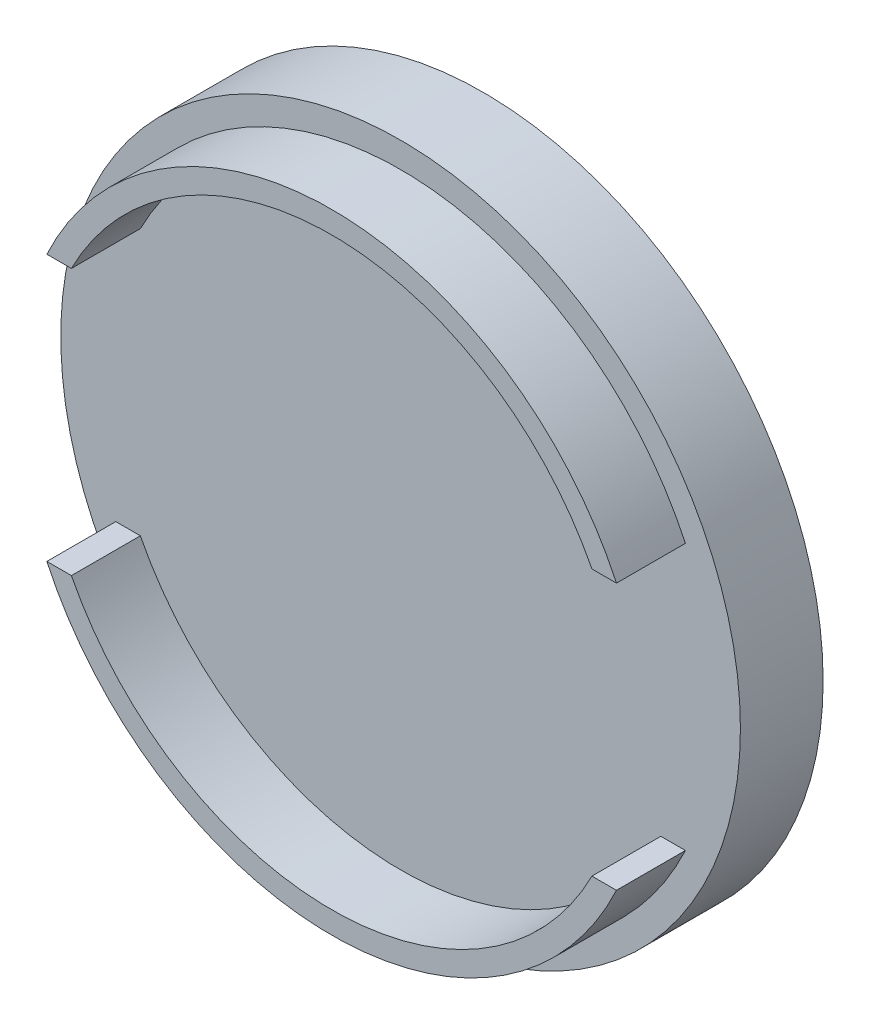
ISO-10303-21;
HEADER;
FILE_DESCRIPTION(('STEP AP214'),'2;1');
FILE_NAME('part.step','',(''),(''),'','','');
FILE_SCHEMA(('AUTOMOTIVE_DESIGN { 1 0 10303 214 1 1 1 1 }'));
ENDSEC;
DATA;
#1=APPLICATION_CONTEXT('core data for automotive mechanical design processes');
#2=APPLICATION_PROTOCOL_DEFINITION('international standard','automotive_design',2000,#1);
#3=PRODUCT_CONTEXT('',#1,'mechanical');
#4=PRODUCT('Part','Part','',(#3));
#5=PRODUCT_RELATED_PRODUCT_CATEGORY('part','',(#4));
#6=PRODUCT_DEFINITION_FORMATION('','',#4);
#7=PRODUCT_DEFINITION_CONTEXT('part definition',#1,'design');
#8=PRODUCT_DEFINITION('design','',#6,#7);
#9=PRODUCT_DEFINITION_SHAPE('','',#8);
#10=(LENGTH_UNIT() NAMED_UNIT(*) SI_UNIT(.MILLI.,.METRE.));
#11=(NAMED_UNIT(*) PLANE_ANGLE_UNIT() SI_UNIT($,.RADIAN.));
#12=(NAMED_UNIT(*) SI_UNIT($,.STERADIAN.) SOLID_ANGLE_UNIT());
#13=UNCERTAINTY_MEASURE_WITH_UNIT(LENGTH_MEASURE(1.E-05),#10,'distance_accuracy_value','');
#14=(GEOMETRIC_REPRESENTATION_CONTEXT(3) GLOBAL_UNCERTAINTY_ASSIGNED_CONTEXT((#13)) GLOBAL_UNIT_ASSIGNED_CONTEXT((#10,
#11,#12)) REPRESENTATION_CONTEXT('',''));
#15=CARTESIAN_POINT('',(0.,0.,0.));
#16=DIRECTION('',(0.,0.,1.));
#17=DIRECTION('',(1.,0.,0.));
#18=AXIS2_PLACEMENT_3D('',#15,#16,#17);
#19=CARTESIAN_POINT('',(0.,0.,11.));
#20=DIRECTION('',(0.,0.,1.));
#21=DIRECTION('',(1.,0.,0.));
#22=AXIS2_PLACEMENT_3D('',#19,#20,#21);
#23=PLANE('',#22);
#24=DIRECTION('',(-1.,0.,0.));
#25=VECTOR('',#24,1.);
#26=CARTESIAN_POINT('',(18.8778187983431,9.64717354549633,11.));
#27=LINE('',#26,#25);
#28=CARTESIAN_POINT('',(20.6584617671083,9.64717354549633,11.));
#29=VERTEX_POINT('',#28);
#30=CARTESIAN_POINT('',(18.8778187983431,9.64717354549633,11.));
#31=VERTEX_POINT('',#30);
#32=EDGE_CURVE('E107',#29,#31,#27,.T.);
#33=ORIENTED_EDGE('',*,*,#32,.F.);
#34=CARTESIAN_POINT('',(0.,0.,11.));
#35=DIRECTION('',(0.,0.,1.));
#36=DIRECTION('',(1.,0.,0.));
#37=AXIS2_PLACEMENT_3D('',#34,#35,#36);
#38=CIRCLE('',#37,22.8);
#39=CARTESIAN_POINT('',(-20.6584617671083,9.64717354549633,11.));
#40=VERTEX_POINT('',#39);
#41=EDGE_CURVE('E129',#29,#40,#38,.T.);
#42=ORIENTED_EDGE('',*,*,#41,.T.);
#43=DIRECTION('',(-1.,0.,0.));
#44=VECTOR('',#43,1.);
#45=CARTESIAN_POINT('',(-20.6584617671083,9.64717354549633,11.));
#46=LINE('',#45,#44);
#47=CARTESIAN_POINT('',(-18.8778187983431,9.64717354549633,11.));
#48=VERTEX_POINT('',#47);
#49=EDGE_CURVE('E154',#48,#40,#46,.T.);
#50=ORIENTED_EDGE('',*,*,#49,.F.);
#51=CARTESIAN_POINT('',(0.,0.,11.));
#52=DIRECTION('',(0.,0.,1.));
#53=DIRECTION('',(1.,0.,0.));
#54=AXIS2_PLACEMENT_3D('',#51,#52,#53);
#55=CIRCLE('',#54,21.2);
#56=EDGE_CURVE('E138',#31,#48,#55,.T.);
#57=ORIENTED_EDGE('',*,*,#56,.F.);
#58=EDGE_LOOP('',(#33,#42,#50,#57));
#59=FACE_BOUND('',#58,.T.);
#60=ADVANCED_FACE('F33',(#59),#23,.T.);
#61=CARTESIAN_POINT('',(0.,0.,11.));
#62=DIRECTION('',(0.,0.,-1.));
#63=DIRECTION('',(-1.,0.,0.));
#64=AXIS2_PLACEMENT_3D('',#61,#62,#63);
#65=CYLINDRICAL_SURFACE('',#64,22.8);
#66=ORIENTED_EDGE('',*,*,#41,.F.);
#67=DIRECTION('',(0.,0.,1.));
#68=VECTOR('',#67,1.);
#69=CARTESIAN_POINT('',(20.6584617671083,9.64717354549633,6.));
#70=LINE('',#69,#68);
#71=CARTESIAN_POINT('',(20.6584617671083,9.64717354549633,6.));
#72=VERTEX_POINT('',#71);
#73=EDGE_CURVE('E160',#72,#29,#70,.T.);
#74=ORIENTED_EDGE('',*,*,#73,.F.);
#75=CARTESIAN_POINT('',(0.,0.,6.));
#76=DIRECTION('',(0.,0.,1.));
#77=DIRECTION('',(1.,0.,0.));
#78=AXIS2_PLACEMENT_3D('',#75,#76,#77);
#79=CIRCLE('',#78,22.8);
#80=CARTESIAN_POINT('',(-20.6584617671083,9.64717354549633,6.));
#81=VERTEX_POINT('',#80);
#82=EDGE_CURVE('E131',#72,#81,#79,.T.);
#83=ORIENTED_EDGE('',*,*,#82,.T.);
#84=DIRECTION('',(0.,0.,1.));
#85=VECTOR('',#84,1.);
#86=CARTESIAN_POINT('',(-20.6584617671083,9.64717354549633,6.));
#87=LINE('',#86,#85);
#88=EDGE_CURVE('E143',#81,#40,#87,.T.);
#89=ORIENTED_EDGE('',*,*,#88,.T.);
#90=EDGE_LOOP('',(#66,#74,#83,#89));
#91=FACE_BOUND('',#90,.T.);
#92=ADVANCED_FACE('F191',(#91),#65,.T.);
#93=CARTESIAN_POINT('',(0.,0.,11.));
#94=DIRECTION('',(0.,0.,-1.));
#95=DIRECTION('',(-1.,0.,0.));
#96=AXIS2_PLACEMENT_3D('',#93,#94,#95);
#97=CYLINDRICAL_SURFACE('',#96,21.2);
#98=DIRECTION('',(0.,0.,1.));
#99=VECTOR('',#98,1.);
#100=CARTESIAN_POINT('',(18.8778187983431,9.64717354549633,6.));
#101=LINE('',#100,#99);
#102=CARTESIAN_POINT('',(18.8778187983431,9.64717354549633,6.));
#103=VERTEX_POINT('',#102);
#104=EDGE_CURVE('E162',#103,#31,#101,.T.);
#105=ORIENTED_EDGE('',*,*,#104,.T.);
#106=ORIENTED_EDGE('',*,*,#56,.T.);
#107=DIRECTION('',(0.,0.,1.));
#108=VECTOR('',#107,1.);
#109=CARTESIAN_POINT('',(-18.8778187983431,9.64717354549633,6.));
#110=LINE('',#109,#108);
#111=CARTESIAN_POINT('',(-18.8778187983431,9.64717354549633,6.));
#112=VERTEX_POINT('',#111);
#113=EDGE_CURVE('E141',#112,#48,#110,.T.);
#114=ORIENTED_EDGE('',*,*,#113,.F.);
#115=CARTESIAN_POINT('',(0.,0.,6.));
#116=DIRECTION('',(0.,0.,1.));
#117=DIRECTION('',(1.,0.,0.));
#118=AXIS2_PLACEMENT_3D('',#115,#116,#117);
#119=CIRCLE('',#118,21.2);
#120=EDGE_CURVE('E41',#112,#103,#119,.F.);
#121=ORIENTED_EDGE('',*,*,#120,.T.);
#122=EDGE_LOOP('',(#105,#106,#114,#121));
#123=FACE_BOUND('',#122,.T.);
#124=ADVANCED_FACE('F188',(#123),#97,.F.);
#125=CARTESIAN_POINT('',(0.,0.,6.));
#126=DIRECTION('',(0.,0.,-1.));
#127=DIRECTION('',(-1.,0.,0.));
#128=AXIS2_PLACEMENT_3D('',#125,#126,#127);
#129=CYLINDRICAL_SURFACE('',#128,24.65);
#130=CARTESIAN_POINT('',(0.,0.,6.));
#131=DIRECTION('',(0.,0.,1.));
#132=DIRECTION('',(1.,0.,0.));
#133=AXIS2_PLACEMENT_3D('',#130,#131,#132);
#134=CIRCLE('',#133,24.65);
#135=CARTESIAN_POINT('',(24.65,0.,6.));
#136=VERTEX_POINT('',#135);
#137=EDGE_CURVE('E123',#136,#136,#134,.T.);
#138=ORIENTED_EDGE('',*,*,#137,.F.);
#139=EDGE_LOOP('',(#138));
#140=FACE_BOUND('',#139,.T.);
#141=CARTESIAN_POINT('',(0.,0.,0.));
#142=DIRECTION('',(0.,0.,1.));
#143=DIRECTION('',(1.,0.,0.));
#144=AXIS2_PLACEMENT_3D('',#141,#142,#143);
#145=CIRCLE('',#144,24.65);
#146=CARTESIAN_POINT('',(24.65,0.,0.));
#147=VERTEX_POINT('',#146);
#148=EDGE_CURVE('E125',#147,#147,#145,.T.);
#149=ORIENTED_EDGE('',*,*,#148,.T.);
#150=EDGE_LOOP('',(#149));
#151=FACE_BOUND('',#150,.T.);
#152=ADVANCED_FACE('F35',(#140,#151),#129,.T.);
#153=CARTESIAN_POINT('',(0.,0.,6.));
#154=DIRECTION('',(0.,0.,1.));
#155=DIRECTION('',(1.,0.,0.));
#156=AXIS2_PLACEMENT_3D('',#153,#154,#155);
#157=PLANE('',#156);
#158=ORIENTED_EDGE('',*,*,#82,.F.);
#159=DIRECTION('',(-1.,0.,0.));
#160=VECTOR('',#159,1.);
#161=CARTESIAN_POINT('',(18.8778187983431,9.64717354549633,6.));
#162=LINE('',#161,#160);
#163=EDGE_CURVE('E48',#72,#103,#162,.T.);
#164=ORIENTED_EDGE('',*,*,#163,.T.);
#165=ORIENTED_EDGE('',*,*,#120,.F.);
#166=DIRECTION('',(-1.,0.,0.));
#167=VECTOR('',#166,1.);
#168=CARTESIAN_POINT('',(-20.6584617671083,9.64717354549633,6.));
#169=LINE('',#168,#167);
#170=EDGE_CURVE('E153',#112,#81,#169,.T.);
#171=ORIENTED_EDGE('',*,*,#170,.T.);
#172=EDGE_LOOP('',(#158,#164,#165,#171));
#173=FACE_BOUND('',#172,.T.);
#174=DIRECTION('',(1.,0.,0.));
#175=VECTOR('',#174,1.);
#176=CARTESIAN_POINT('',(20.6584617671083,-9.64717354549633,6.));
#177=LINE('',#176,#175);
#178=CARTESIAN_POINT('',(18.8778187983431,-9.64717354549633,6.));
#179=VERTEX_POINT('',#178);
#180=CARTESIAN_POINT('',(20.6584617671083,-9.64717354549634,6.));
#181=VERTEX_POINT('',#180);
#182=EDGE_CURVE('E99',#179,#181,#177,.T.);
#183=ORIENTED_EDGE('',*,*,#182,.T.);
#184=CARTESIAN_POINT('',(-20.6584617671083,-9.64717354549633,6.));
#185=VERTEX_POINT('',#184);
#186=EDGE_CURVE('E135',#185,#181,#79,.T.);
#187=ORIENTED_EDGE('',*,*,#186,.F.);
#188=DIRECTION('',(1.,0.,0.));
#189=VECTOR('',#188,1.);
#190=CARTESIAN_POINT('',(-18.8778187983431,-9.64717354549633,6.));
#191=LINE('',#190,#189);
#192=CARTESIAN_POINT('',(-18.8778187983431,-9.64717354549633,6.));
#193=VERTEX_POINT('',#192);
#194=EDGE_CURVE('E56',#185,#193,#191,.T.);
#195=ORIENTED_EDGE('',*,*,#194,.T.);
#196=EDGE_CURVE('E11',#179,#193,#119,.F.);
#197=ORIENTED_EDGE('',*,*,#196,.F.);
#198=EDGE_LOOP('',(#183,#187,#195,#197));
#199=FACE_BOUND('',#198,.T.);
#200=ORIENTED_EDGE('',*,*,#137,.T.);
#201=EDGE_LOOP('',(#200));
#202=FACE_BOUND('',#201,.T.);
#203=ADVANCED_FACE('F116',(#173,#199,#202),#157,.T.);
#204=CARTESIAN_POINT('',(0.,0.,0.));
#205=DIRECTION('',(0.,0.,1.));
#206=DIRECTION('',(1.,0.,0.));
#207=AXIS2_PLACEMENT_3D('',#204,#205,#206);
#208=PLANE('',#207);
#209=ORIENTED_EDGE('',*,*,#148,.F.);
#210=EDGE_LOOP('',(#209));
#211=FACE_BOUND('',#210,.T.);
#212=ADVANCED_FACE('F119',(#211),#208,.F.);
#213=DIRECTION('',(1.,0.,0.));
#214=VECTOR('',#213,1.);
#215=CARTESIAN_POINT('',(20.6584617671083,-9.64717354549633,11.));
#216=LINE('',#215,#214);
#217=CARTESIAN_POINT('',(18.8778187983431,-9.64717354549633,11.));
#218=VERTEX_POINT('',#217);
#219=CARTESIAN_POINT('',(20.6584617671083,-9.64717354549634,11.));
#220=VERTEX_POINT('',#219);
#221=EDGE_CURVE('E150',#218,#220,#216,.T.);
#222=ORIENTED_EDGE('',*,*,#221,.F.);
#223=CARTESIAN_POINT('',(-18.8778187983431,-9.64717354549633,11.));
#224=VERTEX_POINT('',#223);
#225=EDGE_CURVE('E114',#224,#218,#55,.T.);
#226=ORIENTED_EDGE('',*,*,#225,.F.);
#227=DIRECTION('',(1.,0.,0.));
#228=VECTOR('',#227,1.);
#229=CARTESIAN_POINT('',(-18.8778187983431,-9.64717354549633,11.));
#230=LINE('',#229,#228);
#231=CARTESIAN_POINT('',(-20.6584617671083,-9.64717354549633,11.));
#232=VERTEX_POINT('',#231);
#233=EDGE_CURVE('E151',#232,#224,#230,.T.);
#234=ORIENTED_EDGE('',*,*,#233,.F.);
#235=EDGE_CURVE('E134',#232,#220,#38,.T.);
#236=ORIENTED_EDGE('',*,*,#235,.T.);
#237=EDGE_LOOP('',(#222,#226,#234,#236));
#238=FACE_BOUND('',#237,.T.);
#239=ADVANCED_FACE('F174',(#238),#23,.T.);
#240=ORIENTED_EDGE('',*,*,#186,.T.);
#241=DIRECTION('',(0.,0.,1.));
#242=VECTOR('',#241,1.);
#243=CARTESIAN_POINT('',(20.6584617671083,-9.64717354549634,6.));
#244=LINE('',#243,#242);
#245=EDGE_CURVE('E105',#181,#220,#244,.T.);
#246=ORIENTED_EDGE('',*,*,#245,.T.);
#247=ORIENTED_EDGE('',*,*,#235,.F.);
#248=DIRECTION('',(0.,0.,1.));
#249=VECTOR('',#248,1.);
#250=CARTESIAN_POINT('',(-20.6584617671083,-9.64717354549633,6.));
#251=LINE('',#250,#249);
#252=EDGE_CURVE('E146',#185,#232,#251,.T.);
#253=ORIENTED_EDGE('',*,*,#252,.F.);
#254=EDGE_LOOP('',(#240,#246,#247,#253));
#255=FACE_BOUND('',#254,.T.);
#256=ADVANCED_FACE('F171',(#255),#65,.T.);
#257=DIRECTION('',(0.,0.,1.));
#258=VECTOR('',#257,1.);
#259=CARTESIAN_POINT('',(18.8778187983431,-9.64717354549633,6.));
#260=LINE('',#259,#258);
#261=EDGE_CURVE('E102',#179,#218,#260,.T.);
#262=ORIENTED_EDGE('',*,*,#261,.F.);
#263=ORIENTED_EDGE('',*,*,#196,.T.);
#264=DIRECTION('',(0.,0.,1.));
#265=VECTOR('',#264,1.);
#266=CARTESIAN_POINT('',(-18.8778187983431,-9.64717354549633,6.));
#267=LINE('',#266,#265);
#268=EDGE_CURVE('E148',#193,#224,#267,.T.);
#269=ORIENTED_EDGE('',*,*,#268,.T.);
#270=ORIENTED_EDGE('',*,*,#225,.T.);
#271=EDGE_LOOP('',(#262,#263,#269,#270));
#272=FACE_BOUND('',#271,.T.);
#273=ADVANCED_FACE('F111',(#272),#97,.F.);
#274=CARTESIAN_POINT('',(-18.8778187983431,-9.64717354549633,6.));
#275=DIRECTION('',(0.,-1.,0.));
#276=DIRECTION('',(0.,0.,-1.));
#277=AXIS2_PLACEMENT_3D('',#274,#275,#276);
#278=PLANE('',#277);
#279=ORIENTED_EDGE('',*,*,#233,.T.);
#280=ORIENTED_EDGE('',*,*,#268,.F.);
#281=ORIENTED_EDGE('',*,*,#194,.F.);
#282=ORIENTED_EDGE('',*,*,#252,.T.);
#283=EDGE_LOOP('',(#279,#280,#281,#282));
#284=FACE_BOUND('',#283,.T.);
#285=ADVANCED_FACE('F176',(#284),#278,.F.);
#286=CARTESIAN_POINT('',(-20.6584617671083,9.64717354549633,6.));
#287=DIRECTION('',(0.,1.,0.));
#288=DIRECTION('',(0.,0.,1.));
#289=AXIS2_PLACEMENT_3D('',#286,#287,#288);
#290=PLANE('',#289);
#291=ORIENTED_EDGE('',*,*,#49,.T.);
#292=ORIENTED_EDGE('',*,*,#88,.F.);
#293=ORIENTED_EDGE('',*,*,#170,.F.);
#294=ORIENTED_EDGE('',*,*,#113,.T.);
#295=EDGE_LOOP('',(#291,#292,#293,#294));
#296=FACE_BOUND('',#295,.T.);
#297=ADVANCED_FACE('F178',(#296),#290,.F.);
#298=CARTESIAN_POINT('',(18.8778187983431,9.64717354549633,6.));
#299=DIRECTION('',(0.,1.,0.));
#300=DIRECTION('',(0.,0.,1.));
#301=AXIS2_PLACEMENT_3D('',#298,#299,#300);
#302=PLANE('',#301);
#303=ORIENTED_EDGE('',*,*,#32,.T.);
#304=ORIENTED_EDGE('',*,*,#104,.F.);
#305=ORIENTED_EDGE('',*,*,#163,.F.);
#306=ORIENTED_EDGE('',*,*,#73,.T.);
#307=EDGE_LOOP('',(#303,#304,#305,#306));
#308=FACE_BOUND('',#307,.T.);
#309=ADVANCED_FACE('F184',(#308),#302,.F.);
#310=CARTESIAN_POINT('',(20.6584617671083,-9.64717354549633,6.));
#311=DIRECTION('',(0.,-1.,0.));
#312=DIRECTION('',(0.,0.,-1.));
#313=AXIS2_PLACEMENT_3D('',#310,#311,#312);
#314=PLANE('',#313);
#315=ORIENTED_EDGE('',*,*,#221,.T.);
#316=ORIENTED_EDGE('',*,*,#245,.F.);
#317=ORIENTED_EDGE('',*,*,#182,.F.);
#318=ORIENTED_EDGE('',*,*,#261,.T.);
#319=EDGE_LOOP('',(#315,#316,#317,#318));
#320=FACE_BOUND('',#319,.T.);
#321=ADVANCED_FACE('F101',(#320),#314,.F.);
#322=CLOSED_SHELL('',(#60,#92,#124,#152,#203,#212,#239,#256,#273,#285,#297,#309,#321));
#323=MANIFOLD_SOLID_BREP('B2',#322);
#324=ADVANCED_BREP_SHAPE_REPRESENTATION('',(#18,#323),#14);
#325=SHAPE_DEFINITION_REPRESENTATION(#9,#324);
ENDSEC;
END-ISO-10303-21;
